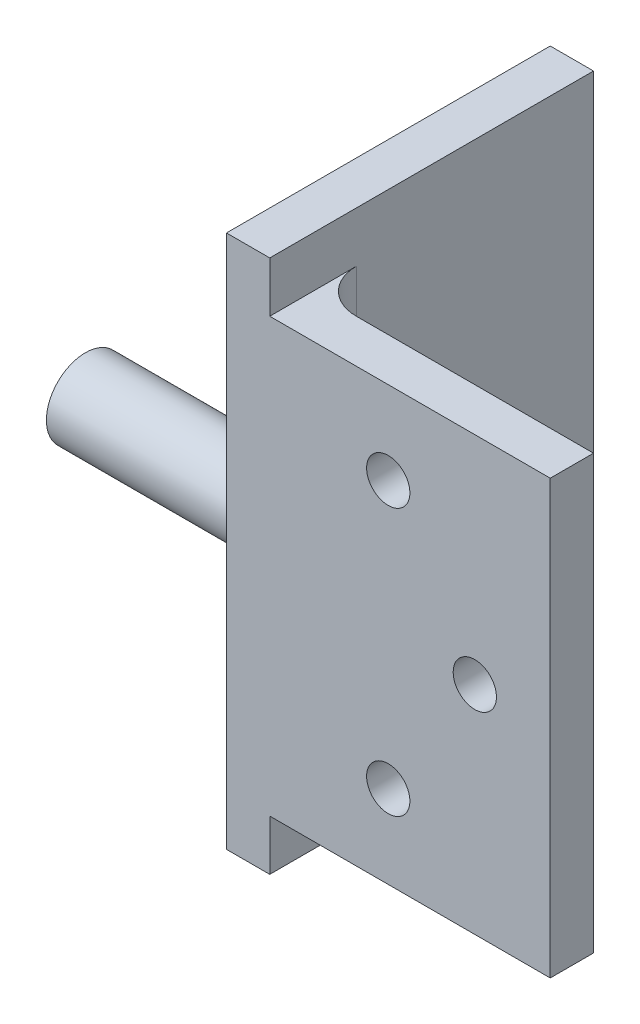
ISO-10303-21;
HEADER;
FILE_DESCRIPTION(('STEP AP214'),'2;1');
FILE_NAME('part.step','',(''),(''),'','','');
FILE_SCHEMA(('AUTOMOTIVE_DESIGN { 1 0 10303 214 1 1 1 1 }'));
ENDSEC;
DATA;
#1=APPLICATION_CONTEXT('core data for automotive mechanical design processes');
#2=APPLICATION_PROTOCOL_DEFINITION('international standard','automotive_design',2000,#1);
#3=PRODUCT_CONTEXT('',#1,'mechanical');
#4=PRODUCT('Part','Part','',(#3));
#5=PRODUCT_RELATED_PRODUCT_CATEGORY('part','',(#4));
#6=PRODUCT_DEFINITION_FORMATION('','',#4);
#7=PRODUCT_DEFINITION_CONTEXT('part definition',#1,'design');
#8=PRODUCT_DEFINITION('design','',#6,#7);
#9=PRODUCT_DEFINITION_SHAPE('','',#8);
#10=(LENGTH_UNIT() NAMED_UNIT(*) SI_UNIT(.MILLI.,.METRE.));
#11=(NAMED_UNIT(*) PLANE_ANGLE_UNIT() SI_UNIT($,.RADIAN.));
#12=(NAMED_UNIT(*) SI_UNIT($,.STERADIAN.) SOLID_ANGLE_UNIT());
#13=UNCERTAINTY_MEASURE_WITH_UNIT(LENGTH_MEASURE(1.E-05),#10,'distance_accuracy_value','');
#14=(GEOMETRIC_REPRESENTATION_CONTEXT(3) GLOBAL_UNCERTAINTY_ASSIGNED_CONTEXT((#13)) GLOBAL_UNIT_ASSIGNED_CONTEXT((#10,
#11,#12)) REPRESENTATION_CONTEXT('',''));
#15=CARTESIAN_POINT('',(0.,0.,0.));
#16=DIRECTION('',(0.,0.,1.));
#17=DIRECTION('',(1.,0.,0.));
#18=AXIS2_PLACEMENT_3D('',#15,#16,#17);
#19=CARTESIAN_POINT('',(22.44,37.,-3.));
#20=DIRECTION('',(0.,0.,1.));
#21=DIRECTION('',(1.,0.,0.));
#22=AXIS2_PLACEMENT_3D('',#19,#20,#21);
#23=PLANE('',#22);
#24=CARTESIAN_POINT('',(11.2127855634639,27.75,-3.));
#25=DIRECTION('',(0.,0.,1.));
#26=DIRECTION('',(1.,0.,0.));
#27=AXIS2_PLACEMENT_3D('',#24,#25,#26);
#28=CIRCLE('',#27,1.5);
#29=CARTESIAN_POINT('',(12.7127855634639,27.75,-3.));
#30=VERTEX_POINT('',#29);
#31=EDGE_CURVE('E188',#30,#30,#28,.T.);
#32=ORIENTED_EDGE('',*,*,#31,.T.);
#33=EDGE_LOOP('',(#32));
#34=FACE_BOUND('',#33,.T.);
#35=CARTESIAN_POINT('',(17.2127855634639,18.5,-3.));
#36=DIRECTION('',(0.,0.,1.));
#37=DIRECTION('',(1.,0.,0.));
#38=AXIS2_PLACEMENT_3D('',#35,#36,#37);
#39=CIRCLE('',#38,1.5);
#40=CARTESIAN_POINT('',(18.7127855634639,18.5,-3.));
#41=VERTEX_POINT('',#40);
#42=EDGE_CURVE('E184',#41,#41,#39,.T.);
#43=ORIENTED_EDGE('',*,*,#42,.T.);
#44=EDGE_LOOP('',(#43));
#45=FACE_BOUND('',#44,.T.);
#46=CARTESIAN_POINT('',(11.2127855634639,9.25,-3.));
#47=DIRECTION('',(0.,0.,1.));
#48=DIRECTION('',(1.,0.,0.));
#49=AXIS2_PLACEMENT_3D('',#46,#47,#48);
#50=CIRCLE('',#49,1.5);
#51=CARTESIAN_POINT('',(12.7127855634639,9.25,-3.));
#52=VERTEX_POINT('',#51);
#53=EDGE_CURVE('E180',#52,#52,#50,.T.);
#54=ORIENTED_EDGE('',*,*,#53,.T.);
#55=EDGE_LOOP('',(#54));
#56=FACE_BOUND('',#55,.T.);
#57=DIRECTION('',(0.,-1.,0.));
#58=VECTOR('',#57,1.);
#59=CARTESIAN_POINT('',(22.44,37.,-3.));
#60=LINE('',#59,#58);
#61=CARTESIAN_POINT('',(22.44,33.5,-3.));
#62=VERTEX_POINT('',#61);
#63=CARTESIAN_POINT('',(22.44,3.5,-3.));
#64=VERTEX_POINT('',#63);
#65=EDGE_CURVE('E206',#62,#64,#60,.T.);
#66=ORIENTED_EDGE('',*,*,#65,.T.);
#67=DIRECTION('',(-1.,0.,0.));
#68=VECTOR('',#67,1.);
#69=CARTESIAN_POINT('',(22.44,3.5,-3.));
#70=LINE('',#69,#68);
#71=CARTESIAN_POINT('',(6.,3.5,-3.));
#72=VERTEX_POINT('',#71);
#73=EDGE_CURVE('E176',#64,#72,#70,.T.);
#74=ORIENTED_EDGE('',*,*,#73,.T.);
#75=DIRECTION('',(0.,-1.,0.));
#76=VECTOR('',#75,1.);
#77=CARTESIAN_POINT('',(6.,37.,-3.));
#78=LINE('',#77,#76);
#79=CARTESIAN_POINT('',(6.,33.5,-3.));
#80=VERTEX_POINT('',#79);
#81=EDGE_CURVE('E235',#72,#80,#78,.F.);
#82=ORIENTED_EDGE('',*,*,#81,.T.);
#83=DIRECTION('',(1.,0.,0.));
#84=VECTOR('',#83,1.);
#85=CARTESIAN_POINT('',(22.44,33.5,-3.));
#86=LINE('',#85,#84);
#87=EDGE_CURVE('E69',#80,#62,#86,.T.);
#88=ORIENTED_EDGE('',*,*,#87,.T.);
#89=EDGE_LOOP('',(#66,#74,#82,#88));
#90=FACE_BOUND('',#89,.T.);
#91=ADVANCED_FACE('F45',(#34,#45,#56,#90),#23,.F.);
#92=CARTESIAN_POINT('',(3.,37.,-3.));
#93=DIRECTION('',(-1.,0.,0.));
#94=DIRECTION('',(0.,0.,1.));
#95=AXIS2_PLACEMENT_3D('',#92,#93,#94);
#96=PLANE('',#95);
#97=DIRECTION('',(0.,-1.,0.));
#98=VECTOR('',#97,1.);
#99=CARTESIAN_POINT('',(3.,0.,-6.));
#100=LINE('',#99,#98);
#101=CARTESIAN_POINT('',(3.,33.5,-6.));
#102=VERTEX_POINT('',#101);
#103=CARTESIAN_POINT('',(3.,3.5,-6.));
#104=VERTEX_POINT('',#103);
#105=EDGE_CURVE('E124',#102,#104,#100,.T.);
#106=ORIENTED_EDGE('',*,*,#105,.T.);
#107=DIRECTION('',(0.,0.,-1.));
#108=VECTOR('',#107,1.);
#109=CARTESIAN_POINT('',(3.,3.5,0.));
#110=LINE('',#109,#108);
#111=CARTESIAN_POINT('',(3.,3.5,0.));
#112=VERTEX_POINT('',#111);
#113=EDGE_CURVE('E61',#112,#104,#110,.T.);
#114=ORIENTED_EDGE('',*,*,#113,.F.);
#115=DIRECTION('',(0.,1.,0.));
#116=VECTOR('',#115,1.);
#117=CARTESIAN_POINT('',(3.,0.,0.));
#118=LINE('',#117,#116);
#119=CARTESIAN_POINT('',(3.,0.,0.));
#120=VERTEX_POINT('',#119);
#121=EDGE_CURVE('E120',#120,#112,#118,.T.);
#122=ORIENTED_EDGE('',*,*,#121,.F.);
#123=DIRECTION('',(0.,0.,-1.));
#124=VECTOR('',#123,1.);
#125=CARTESIAN_POINT('',(3.,0.,-3.));
#126=LINE('',#125,#124);
#127=CARTESIAN_POINT('',(3.,0.,-22.44));
#128=VERTEX_POINT('',#127);
#129=EDGE_CURVE('E192',#120,#128,#126,.T.);
#130=ORIENTED_EDGE('',*,*,#129,.T.);
#131=DIRECTION('',(0.,-1.,0.));
#132=VECTOR('',#131,1.);
#133=CARTESIAN_POINT('',(3.,37.,-22.44));
#134=LINE('',#133,#132);
#135=CARTESIAN_POINT('',(3.,37.,-22.44));
#136=VERTEX_POINT('',#135);
#137=EDGE_CURVE('E230',#136,#128,#134,.T.);
#138=ORIENTED_EDGE('',*,*,#137,.F.);
#139=DIRECTION('',(0.,0.,-1.));
#140=VECTOR('',#139,1.);
#141=CARTESIAN_POINT('',(3.,37.,-3.));
#142=LINE('',#141,#140);
#143=CARTESIAN_POINT('',(3.,37.,0.));
#144=VERTEX_POINT('',#143);
#145=EDGE_CURVE('E193',#144,#136,#142,.T.);
#146=ORIENTED_EDGE('',*,*,#145,.F.);
#147=DIRECTION('',(0.,1.,0.));
#148=VECTOR('',#147,1.);
#149=CARTESIAN_POINT('',(3.,37.,0.));
#150=LINE('',#149,#148);
#151=CARTESIAN_POINT('',(3.,33.5,0.));
#152=VERTEX_POINT('',#151);
#153=EDGE_CURVE('E142',#152,#144,#150,.T.);
#154=ORIENTED_EDGE('',*,*,#153,.F.);
#155=DIRECTION('',(0.,0.,-1.));
#156=VECTOR('',#155,1.);
#157=CARTESIAN_POINT('',(3.,33.5,0.));
#158=LINE('',#157,#156);
#159=EDGE_CURVE('E156',#152,#102,#158,.T.);
#160=ORIENTED_EDGE('',*,*,#159,.T.);
#161=EDGE_LOOP('',(#106,#114,#122,#130,#138,#146,#154,#160));
#162=FACE_BOUND('',#161,.T.);
#163=ADVANCED_FACE('F117',(#162),#96,.F.);
#164=CARTESIAN_POINT('',(3.,37.,-22.44));
#165=DIRECTION('',(0.,0.,1.));
#166=DIRECTION('',(1.,0.,0.));
#167=AXIS2_PLACEMENT_3D('',#164,#165,#166);
#168=PLANE('',#167);
#169=DIRECTION('',(-1.,0.,0.));
#170=VECTOR('',#169,1.);
#171=CARTESIAN_POINT('',(3.,0.,-22.44));
#172=LINE('',#171,#170);
#173=CARTESIAN_POINT('',(0.,0.,-22.44));
#174=VERTEX_POINT('',#173);
#175=EDGE_CURVE('E209',#128,#174,#172,.T.);
#176=ORIENTED_EDGE('',*,*,#175,.T.);
#177=DIRECTION('',(0.,-1.,0.));
#178=VECTOR('',#177,1.);
#179=CARTESIAN_POINT('',(0.,37.,-22.44));
#180=LINE('',#179,#178);
#181=CARTESIAN_POINT('',(0.,37.,-22.44));
#182=VERTEX_POINT('',#181);
#183=EDGE_CURVE('E226',#182,#174,#180,.T.);
#184=ORIENTED_EDGE('',*,*,#183,.F.);
#185=DIRECTION('',(-1.,0.,0.));
#186=VECTOR('',#185,1.);
#187=CARTESIAN_POINT('',(3.,37.,-22.44));
#188=LINE('',#187,#186);
#189=EDGE_CURVE('E196',#136,#182,#188,.T.);
#190=ORIENTED_EDGE('',*,*,#189,.F.);
#191=ORIENTED_EDGE('',*,*,#137,.T.);
#192=EDGE_LOOP('',(#176,#184,#190,#191));
#193=FACE_BOUND('',#192,.T.);
#194=ADVANCED_FACE('F265',(#193),#168,.F.);
#195=CARTESIAN_POINT('',(0.,37.,-22.44));
#196=DIRECTION('',(1.,0.,0.));
#197=DIRECTION('',(0.,0.,-1.));
#198=AXIS2_PLACEMENT_3D('',#195,#196,#197);
#199=PLANE('',#198);
#200=CARTESIAN_POINT('',(0.,11.,-11.22));
#201=DIRECTION('',(1.,0.,0.));
#202=DIRECTION('',(0.,0.,-1.));
#203=AXIS2_PLACEMENT_3D('',#200,#201,#202);
#204=CIRCLE('',#203,2.7);
#205=CARTESIAN_POINT('',(0.,11.,-13.92));
#206=VERTEX_POINT('',#205);
#207=EDGE_CURVE('E11',#206,#206,#204,.F.);
#208=ORIENTED_EDGE('',*,*,#207,.F.);
#209=EDGE_LOOP('',(#208));
#210=FACE_BOUND('',#209,.T.);
#211=DIRECTION('',(0.,0.,1.));
#212=VECTOR('',#211,1.);
#213=CARTESIAN_POINT('',(0.,0.,-22.44));
#214=LINE('',#213,#212);
#215=CARTESIAN_POINT('',(0.,0.,0.));
#216=VERTEX_POINT('',#215);
#217=EDGE_CURVE('E212',#174,#216,#214,.T.);
#218=ORIENTED_EDGE('',*,*,#217,.T.);
#219=DIRECTION('',(0.,-1.,0.));
#220=VECTOR('',#219,1.);
#221=CARTESIAN_POINT('',(0.,37.,0.));
#222=LINE('',#221,#220);
#223=CARTESIAN_POINT('',(0.,37.,0.));
#224=VERTEX_POINT('',#223);
#225=EDGE_CURVE('E223',#224,#216,#222,.T.);
#226=ORIENTED_EDGE('',*,*,#225,.F.);
#227=DIRECTION('',(0.,0.,1.));
#228=VECTOR('',#227,1.);
#229=CARTESIAN_POINT('',(0.,37.,-22.44));
#230=LINE('',#229,#228);
#231=EDGE_CURVE('E199',#182,#224,#230,.T.);
#232=ORIENTED_EDGE('',*,*,#231,.F.);
#233=ORIENTED_EDGE('',*,*,#183,.T.);
#234=EDGE_LOOP('',(#218,#226,#232,#233));
#235=FACE_BOUND('',#234,.T.);
#236=ADVANCED_FACE('F266',(#210,#235),#199,.F.);
#237=CARTESIAN_POINT('',(0.,37.,0.));
#238=DIRECTION('',(0.,0.,-1.));
#239=DIRECTION('',(-1.,0.,0.));
#240=AXIS2_PLACEMENT_3D('',#237,#238,#239);
#241=PLANE('',#240);
#242=CARTESIAN_POINT('',(11.2127855634639,27.75,0.));
#243=DIRECTION('',(0.,0.,-1.));
#244=DIRECTION('',(-1.,0.,0.));
#245=AXIS2_PLACEMENT_3D('',#242,#243,#244);
#246=CIRCLE('',#245,1.5);
#247=CARTESIAN_POINT('',(9.71278556346392,27.75,0.));
#248=VERTEX_POINT('',#247);
#249=EDGE_CURVE('E159',#248,#248,#246,.T.);
#250=ORIENTED_EDGE('',*,*,#249,.T.);
#251=EDGE_LOOP('',(#250));
#252=FACE_BOUND('',#251,.T.);
#253=CARTESIAN_POINT('',(17.2127855634639,18.5,0.));
#254=DIRECTION('',(0.,0.,-1.));
#255=DIRECTION('',(-1.,0.,0.));
#256=AXIS2_PLACEMENT_3D('',#253,#254,#255);
#257=CIRCLE('',#256,1.5);
#258=CARTESIAN_POINT('',(15.7127855634639,18.5,0.));
#259=VERTEX_POINT('',#258);
#260=EDGE_CURVE('E166',#259,#259,#257,.T.);
#261=ORIENTED_EDGE('',*,*,#260,.T.);
#262=EDGE_LOOP('',(#261));
#263=FACE_BOUND('',#262,.T.);
#264=CARTESIAN_POINT('',(11.2127855634639,9.25,0.));
#265=DIRECTION('',(0.,0.,-1.));
#266=DIRECTION('',(-1.,0.,0.));
#267=AXIS2_PLACEMENT_3D('',#264,#265,#266);
#268=CIRCLE('',#267,1.5);
#269=CARTESIAN_POINT('',(9.71278556346392,9.25,0.));
#270=VERTEX_POINT('',#269);
#271=EDGE_CURVE('E170',#270,#270,#268,.T.);
#272=ORIENTED_EDGE('',*,*,#271,.T.);
#273=EDGE_LOOP('',(#272));
#274=FACE_BOUND('',#273,.T.);
#275=DIRECTION('',(1.,0.,0.));
#276=VECTOR('',#275,1.);
#277=CARTESIAN_POINT('',(0.,0.,0.));
#278=LINE('',#277,#276);
#279=EDGE_CURVE('E140',#216,#120,#278,.T.);
#280=ORIENTED_EDGE('',*,*,#279,.T.);
#281=ORIENTED_EDGE('',*,*,#121,.T.);
#282=DIRECTION('',(1.,0.,0.));
#283=VECTOR('',#282,1.);
#284=CARTESIAN_POINT('',(3.,3.5,0.));
#285=LINE('',#284,#283);
#286=CARTESIAN_POINT('',(22.44,3.5,0.));
#287=VERTEX_POINT('',#286);
#288=EDGE_CURVE('E127',#112,#287,#285,.T.);
#289=ORIENTED_EDGE('',*,*,#288,.T.);
#290=DIRECTION('',(0.,-1.,0.));
#291=VECTOR('',#290,1.);
#292=CARTESIAN_POINT('',(22.44,37.,0.));
#293=LINE('',#292,#291);
#294=CARTESIAN_POINT('',(22.44,33.5,0.));
#295=VERTEX_POINT('',#294);
#296=EDGE_CURVE('E220',#295,#287,#293,.T.);
#297=ORIENTED_EDGE('',*,*,#296,.F.);
#298=DIRECTION('',(-1.,0.,0.));
#299=VECTOR('',#298,1.);
#300=CARTESIAN_POINT('',(3.,33.5,0.));
#301=LINE('',#300,#299);
#302=EDGE_CURVE('E146',#295,#152,#301,.T.);
#303=ORIENTED_EDGE('',*,*,#302,.T.);
#304=ORIENTED_EDGE('',*,*,#153,.T.);
#305=DIRECTION('',(1.,0.,0.));
#306=VECTOR('',#305,1.);
#307=CARTESIAN_POINT('',(0.,37.,0.));
#308=LINE('',#307,#306);
#309=EDGE_CURVE('E202',#224,#144,#308,.T.);
#310=ORIENTED_EDGE('',*,*,#309,.F.);
#311=ORIENTED_EDGE('',*,*,#225,.T.);
#312=EDGE_LOOP('',(#280,#281,#289,#297,#303,#304,#310,#311));
#313=FACE_BOUND('',#312,.T.);
#314=ADVANCED_FACE('F137',(#252,#263,#274,#313),#241,.F.);
#315=CARTESIAN_POINT('',(22.44,37.,0.));
#316=DIRECTION('',(-1.,0.,0.));
#317=DIRECTION('',(0.,0.,1.));
#318=AXIS2_PLACEMENT_3D('',#315,#316,#317);
#319=PLANE('',#318);
#320=ORIENTED_EDGE('',*,*,#296,.T.);
#321=DIRECTION('',(0.,0.,-1.));
#322=VECTOR('',#321,1.);
#323=CARTESIAN_POINT('',(22.44,3.5,0.));
#324=LINE('',#323,#322);
#325=EDGE_CURVE('E126',#287,#64,#324,.T.);
#326=ORIENTED_EDGE('',*,*,#325,.T.);
#327=ORIENTED_EDGE('',*,*,#65,.F.);
#328=DIRECTION('',(0.,0.,-1.));
#329=VECTOR('',#328,1.);
#330=CARTESIAN_POINT('',(22.44,33.5,0.));
#331=LINE('',#330,#329);
#332=EDGE_CURVE('E153',#295,#62,#331,.T.);
#333=ORIENTED_EDGE('',*,*,#332,.F.);
#334=EDGE_LOOP('',(#320,#326,#327,#333));
#335=FACE_BOUND('',#334,.T.);
#336=ADVANCED_FACE('F248',(#335),#319,.F.);
#337=CARTESIAN_POINT('',(0.,37.,0.));
#338=DIRECTION('',(0.,-1.,0.));
#339=DIRECTION('',(0.,0.,-1.));
#340=AXIS2_PLACEMENT_3D('',#337,#338,#339);
#341=PLANE('',#340);
#342=ORIENTED_EDGE('',*,*,#309,.T.);
#343=ORIENTED_EDGE('',*,*,#145,.T.);
#344=ORIENTED_EDGE('',*,*,#189,.T.);
#345=ORIENTED_EDGE('',*,*,#231,.T.);
#346=EDGE_LOOP('',(#342,#343,#344,#345));
#347=FACE_BOUND('',#346,.T.);
#348=ADVANCED_FACE('F255',(#347),#341,.F.);
#349=CARTESIAN_POINT('',(0.,0.,0.));
#350=DIRECTION('',(0.,-1.,0.));
#351=DIRECTION('',(0.,0.,-1.));
#352=AXIS2_PLACEMENT_3D('',#349,#350,#351);
#353=PLANE('',#352);
#354=ORIENTED_EDGE('',*,*,#129,.F.);
#355=ORIENTED_EDGE('',*,*,#279,.F.);
#356=ORIENTED_EDGE('',*,*,#217,.F.);
#357=ORIENTED_EDGE('',*,*,#175,.F.);
#358=EDGE_LOOP('',(#354,#355,#356,#357));
#359=FACE_BOUND('',#358,.T.);
#360=ADVANCED_FACE('F262',(#359),#353,.T.);
#361=CARTESIAN_POINT('',(6.,37.,-6.));
#362=DIRECTION('',(0.,1.,0.));
#363=DIRECTION('',(0.,0.,1.));
#364=AXIS2_PLACEMENT_3D('',#361,#362,#363);
#365=CYLINDRICAL_SURFACE('',#364,3.);
#366=ORIENTED_EDGE('',*,*,#81,.F.);
#367=CARTESIAN_POINT('',(6.,3.5,-6.));
#368=DIRECTION('',(0.,1.,0.));
#369=DIRECTION('',(-1.,0.,0.));
#370=AXIS2_PLACEMENT_3D('',#367,#368,#369);
#371=CIRCLE('',#370,3.);
#372=EDGE_CURVE('E54',#72,#104,#371,.F.);
#373=ORIENTED_EDGE('',*,*,#372,.T.);
#374=ORIENTED_EDGE('',*,*,#105,.F.);
#375=CARTESIAN_POINT('',(6.,33.5,-6.));
#376=DIRECTION('',(0.,-1.,0.));
#377=DIRECTION('',(0.,0.,-1.));
#378=AXIS2_PLACEMENT_3D('',#375,#376,#377);
#379=CIRCLE('',#378,3.);
#380=EDGE_CURVE('E239',#102,#80,#379,.F.);
#381=ORIENTED_EDGE('',*,*,#380,.T.);
#382=EDGE_LOOP('',(#366,#373,#374,#381));
#383=FACE_BOUND('',#382,.T.);
#384=ADVANCED_FACE('F47',(#383),#365,.F.);
#385=CARTESIAN_POINT('',(3.,33.5,0.));
#386=DIRECTION('',(0.,-1.,0.));
#387=DIRECTION('',(0.,0.,-1.));
#388=AXIS2_PLACEMENT_3D('',#385,#386,#387);
#389=PLANE('',#388);
#390=ORIENTED_EDGE('',*,*,#380,.F.);
#391=ORIENTED_EDGE('',*,*,#159,.F.);
#392=ORIENTED_EDGE('',*,*,#302,.F.);
#393=ORIENTED_EDGE('',*,*,#332,.T.);
#394=ORIENTED_EDGE('',*,*,#87,.F.);
#395=EDGE_LOOP('',(#390,#391,#392,#393,#394));
#396=FACE_BOUND('',#395,.T.);
#397=ADVANCED_FACE('F251',(#396),#389,.F.);
#398=CARTESIAN_POINT('',(3.,3.5,0.));
#399=DIRECTION('',(0.,1.,0.));
#400=DIRECTION('',(-1.,0.,0.));
#401=AXIS2_PLACEMENT_3D('',#398,#399,#400);
#402=PLANE('',#401);
#403=ORIENTED_EDGE('',*,*,#325,.F.);
#404=ORIENTED_EDGE('',*,*,#288,.F.);
#405=ORIENTED_EDGE('',*,*,#113,.T.);
#406=ORIENTED_EDGE('',*,*,#372,.F.);
#407=ORIENTED_EDGE('',*,*,#73,.F.);
#408=EDGE_LOOP('',(#403,#404,#405,#406,#407));
#409=FACE_BOUND('',#408,.T.);
#410=ADVANCED_FACE('F130',(#409),#402,.F.);
#411=CARTESIAN_POINT('',(11.2127855634639,9.25,0.));
#412=DIRECTION('',(0.,0.,-1.));
#413=DIRECTION('',(-1.,0.,0.));
#414=AXIS2_PLACEMENT_3D('',#411,#412,#413);
#415=CYLINDRICAL_SURFACE('',#414,1.5);
#416=ORIENTED_EDGE('',*,*,#271,.F.);
#417=EDGE_LOOP('',(#416));
#418=FACE_BOUND('',#417,.T.);
#419=ORIENTED_EDGE('',*,*,#53,.F.);
#420=EDGE_LOOP('',(#419));
#421=FACE_BOUND('',#420,.T.);
#422=ADVANCED_FACE('F292',(#418,#421),#415,.F.);
#423=CARTESIAN_POINT('',(17.2127855634639,18.5,0.));
#424=DIRECTION('',(0.,0.,-1.));
#425=DIRECTION('',(-1.,0.,0.));
#426=AXIS2_PLACEMENT_3D('',#423,#424,#425);
#427=CYLINDRICAL_SURFACE('',#426,1.5);
#428=ORIENTED_EDGE('',*,*,#260,.F.);
#429=EDGE_LOOP('',(#428));
#430=FACE_BOUND('',#429,.T.);
#431=ORIENTED_EDGE('',*,*,#42,.F.);
#432=EDGE_LOOP('',(#431));
#433=FACE_BOUND('',#432,.T.);
#434=ADVANCED_FACE('F294',(#430,#433),#427,.F.);
#435=CARTESIAN_POINT('',(11.2127855634639,27.75,0.));
#436=DIRECTION('',(0.,0.,-1.));
#437=DIRECTION('',(-1.,0.,0.));
#438=AXIS2_PLACEMENT_3D('',#435,#436,#437);
#439=CYLINDRICAL_SURFACE('',#438,1.5);
#440=ORIENTED_EDGE('',*,*,#249,.F.);
#441=EDGE_LOOP('',(#440));
#442=FACE_BOUND('',#441,.T.);
#443=ORIENTED_EDGE('',*,*,#31,.F.);
#444=EDGE_LOOP('',(#443));
#445=FACE_BOUND('',#444,.T.);
#446=ADVANCED_FACE('F301',(#442,#445),#439,.F.);
#447=CARTESIAN_POINT('',(-21.,11.,-11.22));
#448=DIRECTION('',(1.,0.,0.));
#449=DIRECTION('',(0.,0.,-1.));
#450=AXIS2_PLACEMENT_3D('',#447,#448,#449);
#451=CYLINDRICAL_SURFACE('',#450,2.7);
#452=CARTESIAN_POINT('',(-21.,11.,-11.22));
#453=DIRECTION('',(-1.,0.,0.));
#454=DIRECTION('',(0.,0.,1.));
#455=AXIS2_PLACEMENT_3D('',#452,#453,#454);
#456=CIRCLE('',#455,2.7);
#457=CARTESIAN_POINT('',(-21.,11.,-13.92));
#458=VERTEX_POINT('',#457);
#459=EDGE_CURVE('E149',#458,#458,#456,.T.);
#460=CARTESIAN_POINT('',(-21.,11.,-13.92));
#461=CARTESIAN_POINT('',(-20.78125,11.,-13.92));
#462=CARTESIAN_POINT('',(-20.5625,11.,-13.92));
#463=CARTESIAN_POINT('',(-20.125,11.,-13.92));
#464=CARTESIAN_POINT('',(-19.90625,11.,-13.92));
#465=CARTESIAN_POINT('',(-19.46875,11.,-13.92));
#466=CARTESIAN_POINT('',(-19.25,11.,-13.92));
#467=CARTESIAN_POINT('',(-18.8125,11.,-13.92));
#468=CARTESIAN_POINT('',(-18.59375,11.,-13.92));
#469=CARTESIAN_POINT('',(-18.15625,11.,-13.92));
#470=CARTESIAN_POINT('',(-17.9375,11.,-13.92));
#471=CARTESIAN_POINT('',(-17.5,11.,-13.92));
#472=CARTESIAN_POINT('',(-17.28125,11.,-13.92));
#473=CARTESIAN_POINT('',(-16.84375,11.,-13.92));
#474=CARTESIAN_POINT('',(-16.625,11.,-13.92));
#475=CARTESIAN_POINT('',(-16.1875,11.,-13.92));
#476=CARTESIAN_POINT('',(-15.96875,11.,-13.92));
#477=CARTESIAN_POINT('',(-15.53125,11.,-13.92));
#478=CARTESIAN_POINT('',(-15.3125,11.,-13.92));
#479=CARTESIAN_POINT('',(-14.875,11.,-13.92));
#480=CARTESIAN_POINT('',(-14.65625,11.,-13.92));
#481=CARTESIAN_POINT('',(-14.21875,11.,-13.92));
#482=CARTESIAN_POINT('',(-14.,11.,-13.92));
#483=CARTESIAN_POINT('',(-13.5625,11.,-13.92));
#484=CARTESIAN_POINT('',(-13.34375,11.,-13.92));
#485=CARTESIAN_POINT('',(-12.90625,11.,-13.92));
#486=CARTESIAN_POINT('',(-12.6875,11.,-13.92));
#487=CARTESIAN_POINT('',(-12.25,11.,-13.92));
#488=CARTESIAN_POINT('',(-12.03125,11.,-13.92));
#489=CARTESIAN_POINT('',(-11.59375,11.,-13.92));
#490=CARTESIAN_POINT('',(-11.375,11.,-13.92));
#491=CARTESIAN_POINT('',(-10.9375,11.,-13.92));
#492=CARTESIAN_POINT('',(-10.71875,11.,-13.92));
#493=CARTESIAN_POINT('',(-10.28125,11.,-13.92));
#494=CARTESIAN_POINT('',(-10.0625,11.,-13.92));
#495=CARTESIAN_POINT('',(-9.62499999999999,11.,-13.92));
#496=CARTESIAN_POINT('',(-9.40624999999999,11.,-13.92));
#497=CARTESIAN_POINT('',(-8.96874999999999,11.,-13.92));
#498=CARTESIAN_POINT('',(-8.75,11.,-13.92));
#499=CARTESIAN_POINT('',(-8.31249999999999,11.,-13.92));
#500=CARTESIAN_POINT('',(-8.09374999999999,11.,-13.92));
#501=CARTESIAN_POINT('',(-7.65624999999999,11.,-13.92));
#502=CARTESIAN_POINT('',(-7.43749999999999,11.,-13.92));
#503=CARTESIAN_POINT('',(-6.99999999999999,11.,-13.92));
#504=CARTESIAN_POINT('',(-6.78124999999999,11.,-13.92));
#505=CARTESIAN_POINT('',(-6.34375,11.,-13.92));
#506=CARTESIAN_POINT('',(-6.12499999999999,11.,-13.92));
#507=CARTESIAN_POINT('',(-5.6875,11.,-13.92));
#508=CARTESIAN_POINT('',(-5.46875,11.,-13.92));
#509=CARTESIAN_POINT('',(-5.03125,11.,-13.92));
#510=CARTESIAN_POINT('',(-4.8125,11.,-13.92));
#511=CARTESIAN_POINT('',(-4.375,11.,-13.92));
#512=CARTESIAN_POINT('',(-4.15625,11.,-13.92));
#513=CARTESIAN_POINT('',(-3.71875,11.,-13.92));
#514=CARTESIAN_POINT('',(-3.5,11.,-13.92));
#515=CARTESIAN_POINT('',(-3.0625,11.,-13.92));
#516=CARTESIAN_POINT('',(-2.84375,11.,-13.92));
#517=CARTESIAN_POINT('',(-2.40625,11.,-13.92));
#518=CARTESIAN_POINT('',(-2.1875,11.,-13.92));
#519=CARTESIAN_POINT('',(-1.75,11.,-13.92));
#520=CARTESIAN_POINT('',(-1.53125,11.,-13.92));
#521=CARTESIAN_POINT('',(-1.09375,11.,-13.92));
#522=CARTESIAN_POINT('',(-0.874999999999997,11.,-13.92));
#523=CARTESIAN_POINT('',(-0.437499999999997,11.,-13.92));
#524=CARTESIAN_POINT('',(-0.218749999999997,11.,-13.92));
#525=CARTESIAN_POINT('',(0.,11.,-13.92));
#526=B_SPLINE_CURVE_WITH_KNOTS('',3,(#460,#461,#462,#463,#464,#465,#466,#467,#468,#469,#470,
#471,#472,#473,#474,#475,#476,#477,#478,#479,#480,#481,#482,#483,#484,#485,#486,#487,#488,#489,
#490,#491,#492,#493,#494,#495,#496,#497,#498,#499,#500,#501,#502,#503,#504,#505,#506,#507,#508,
#509,#510,#511,#512,#513,#514,#515,#516,#517,#518,#519,#520,#521,#522,#523,#524,#525),
.UNSPECIFIED.,.F.,.F.,(4,2,2,2,2,2,2,2,2,2,2,2,2,2,2,2,2,2,2,2,2,2,2,2,2,2,2,2,2,2,2,2,4),(0.,
0.656250000000001,1.3125,1.96875,2.625,3.28125,3.9375,4.59375,5.25,5.90625,6.5625,7.21875,7.875,
8.53125,9.1875,9.84375,10.5,11.15625,11.8125,12.46875,13.125,13.78125,14.4375,15.09375,15.75,
16.40625,17.0625,17.71875,18.375,19.03125,19.6875,20.34375,21.),.UNSPECIFIED.);
#527=EDGE_CURVE('BSEAM366',#458,#206,#526,.T.);
#528=ORIENTED_EDGE('',*,*,#459,.F.);
#529=ORIENTED_EDGE('',*,*,#207,.T.);
#530=ORIENTED_EDGE('',*,*,#527,.T.);
#531=ORIENTED_EDGE('',*,*,#527,.F.);
#532=EDGE_LOOP('',(#528,#530,#529,#531));
#533=FACE_BOUND('',#532,.T.);
#534=ADVANCED_FACE('F366',(#533),#451,.T.);
#535=CARTESIAN_POINT('',(-21.,11.,-11.22));
#536=DIRECTION('',(-1.,0.,0.));
#537=DIRECTION('',(0.,0.,1.));
#538=AXIS2_PLACEMENT_3D('',#535,#536,#537);
#539=PLANE('',#538);
#540=ORIENTED_EDGE('',*,*,#459,.T.);
#541=EDGE_LOOP('',(#540));
#542=FACE_BOUND('',#541,.T.);
#543=ADVANCED_FACE('F374',(#542),#539,.T.);
#544=CLOSED_SHELL('',(#91,#163,#194,#236,#314,#336,#348,#360,#384,#397,#410,#422,#434,#446,#534,#543));
#545=MANIFOLD_SOLID_BREP('B2',#544);
#546=ADVANCED_BREP_SHAPE_REPRESENTATION('',(#18,#545),#14);
#547=SHAPE_DEFINITION_REPRESENTATION(#9,#546);
ENDSEC;
END-ISO-10303-21;
